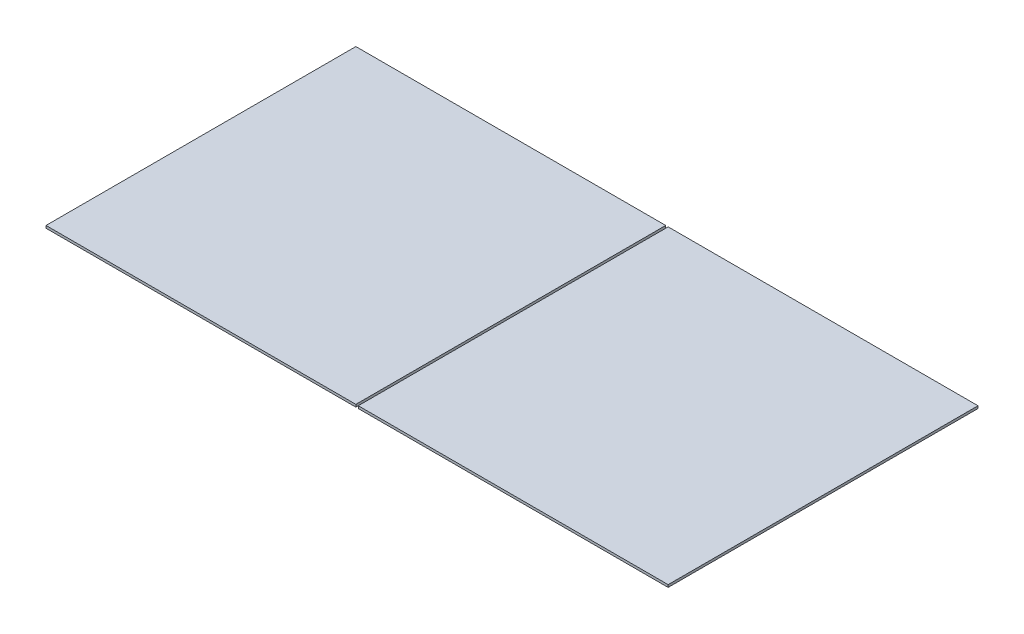
ISO-10303-21;
HEADER;
FILE_DESCRIPTION(('STEP AP214'),'2;1');
FILE_NAME('part.step','',(''),(''),'','','');
FILE_SCHEMA(('AUTOMOTIVE_DESIGN { 1 0 10303 214 1 1 1 1 }'));
ENDSEC;
DATA;
#1=APPLICATION_CONTEXT('core data for automotive mechanical design processes');
#2=APPLICATION_PROTOCOL_DEFINITION('international standard','automotive_design',2000,#1);
#3=PRODUCT_CONTEXT('',#1,'mechanical');
#4=PRODUCT('Part','Part','',(#3));
#5=PRODUCT_RELATED_PRODUCT_CATEGORY('part','',(#4));
#6=PRODUCT_DEFINITION_FORMATION('','',#4);
#7=PRODUCT_DEFINITION_CONTEXT('part definition',#1,'design');
#8=PRODUCT_DEFINITION('design','',#6,#7);
#9=PRODUCT_DEFINITION_SHAPE('','',#8);
#10=(LENGTH_UNIT() NAMED_UNIT(*) SI_UNIT(.MILLI.,.METRE.));
#11=(NAMED_UNIT(*) PLANE_ANGLE_UNIT() SI_UNIT($,.RADIAN.));
#12=(NAMED_UNIT(*) SI_UNIT($,.STERADIAN.) SOLID_ANGLE_UNIT());
#13=UNCERTAINTY_MEASURE_WITH_UNIT(LENGTH_MEASURE(1.E-05),#10,'distance_accuracy_value','');
#14=(GEOMETRIC_REPRESENTATION_CONTEXT(3) GLOBAL_UNCERTAINTY_ASSIGNED_CONTEXT((#13)) GLOBAL_UNIT_ASSIGNED_CONTEXT((#10,
#11,#12)) REPRESENTATION_CONTEXT('',''));
#15=CARTESIAN_POINT('',(0.,0.,0.));
#16=DIRECTION('',(0.,0.,1.));
#17=DIRECTION('',(1.,0.,0.));
#18=AXIS2_PLACEMENT_3D('',#15,#16,#17);
#19=CARTESIAN_POINT('',(191.5,1.,-63.5));
#20=DIRECTION('',(0.,0.,1.));
#21=DIRECTION('',(1.,0.,0.));
#22=AXIS2_PLACEMENT_3D('',#19,#20,#21);
#23=PLANE('',#22);
#24=DIRECTION('',(-1.,0.,0.));
#25=VECTOR('',#24,1.);
#26=CARTESIAN_POINT('',(191.5,0.,-63.5));
#27=LINE('',#26,#25);
#28=CARTESIAN_POINT('',(191.5,0.,-63.5));
#29=VERTEX_POINT('',#28);
#30=CARTESIAN_POINT('',(64.5,0.,-63.5));
#31=VERTEX_POINT('',#30);
#32=EDGE_CURVE('E106',#29,#31,#27,.T.);
#33=ORIENTED_EDGE('',*,*,#32,.T.);
#34=DIRECTION('',(0.,-1.,0.));
#35=VECTOR('',#34,1.);
#36=CARTESIAN_POINT('',(64.5,1.,-63.5));
#37=LINE('',#36,#35);
#38=CARTESIAN_POINT('',(64.5,1.,-63.5));
#39=VERTEX_POINT('',#38);
#40=EDGE_CURVE('E12',#39,#31,#37,.T.);
#41=ORIENTED_EDGE('',*,*,#40,.F.);
#42=DIRECTION('',(-1.,0.,0.));
#43=VECTOR('',#42,1.);
#44=CARTESIAN_POINT('',(191.5,1.,-63.5));
#45=LINE('',#44,#43);
#46=CARTESIAN_POINT('',(191.5,1.,-63.5));
#47=VERTEX_POINT('',#46);
#48=EDGE_CURVE('E94',#47,#39,#45,.T.);
#49=ORIENTED_EDGE('',*,*,#48,.F.);
#50=DIRECTION('',(0.,-1.,0.));
#51=VECTOR('',#50,1.);
#52=CARTESIAN_POINT('',(191.5,1.,-63.5));
#53=LINE('',#52,#51);
#54=EDGE_CURVE('E102',#47,#29,#53,.T.);
#55=ORIENTED_EDGE('',*,*,#54,.T.);
#56=EDGE_LOOP('',(#33,#41,#49,#55));
#57=FACE_BOUND('',#56,.T.);
#58=ADVANCED_FACE('F43',(#57),#23,.F.);
#59=CARTESIAN_POINT('',(64.5,1.,-63.5));
#60=DIRECTION('',(1.,0.,0.));
#61=DIRECTION('',(0.,0.,-1.));
#62=AXIS2_PLACEMENT_3D('',#59,#60,#61);
#63=PLANE('',#62);
#64=DIRECTION('',(0.,0.,1.));
#65=VECTOR('',#64,1.);
#66=CARTESIAN_POINT('',(64.5,0.,-63.5));
#67=LINE('',#66,#65);
#68=CARTESIAN_POINT('',(64.5,0.,63.5));
#69=VERTEX_POINT('',#68);
#70=EDGE_CURVE('E98',#31,#69,#67,.T.);
#71=ORIENTED_EDGE('',*,*,#70,.T.);
#72=DIRECTION('',(0.,-1.,0.));
#73=VECTOR('',#72,1.);
#74=CARTESIAN_POINT('',(64.5,1.,63.5));
#75=LINE('',#74,#73);
#76=CARTESIAN_POINT('',(64.5,1.,63.5));
#77=VERTEX_POINT('',#76);
#78=EDGE_CURVE('E51',#77,#69,#75,.T.);
#79=ORIENTED_EDGE('',*,*,#78,.F.);
#80=DIRECTION('',(0.,0.,1.));
#81=VECTOR('',#80,1.);
#82=CARTESIAN_POINT('',(64.5,1.,-63.5));
#83=LINE('',#82,#81);
#84=EDGE_CURVE('E89',#39,#77,#83,.T.);
#85=ORIENTED_EDGE('',*,*,#84,.F.);
#86=ORIENTED_EDGE('',*,*,#40,.T.);
#87=EDGE_LOOP('',(#71,#79,#85,#86));
#88=FACE_BOUND('',#87,.T.);
#89=ADVANCED_FACE('F97',(#88),#63,.F.);
#90=CARTESIAN_POINT('',(191.5,1.,63.5));
#91=DIRECTION('',(0.,0.,-1.));
#92=DIRECTION('',(-1.,0.,0.));
#93=AXIS2_PLACEMENT_3D('',#90,#91,#92);
#94=PLANE('',#93);
#95=DIRECTION('',(1.,0.,0.));
#96=VECTOR('',#95,1.);
#97=CARTESIAN_POINT('',(191.5,0.,63.5));
#98=LINE('',#97,#96);
#99=CARTESIAN_POINT('',(191.5,0.,63.5));
#100=VERTEX_POINT('',#99);
#101=EDGE_CURVE('E76',#69,#100,#98,.T.);
#102=ORIENTED_EDGE('',*,*,#101,.T.);
#103=DIRECTION('',(0.,-1.,0.));
#104=VECTOR('',#103,1.);
#105=CARTESIAN_POINT('',(191.5,1.,63.5));
#106=LINE('',#105,#104);
#107=CARTESIAN_POINT('',(191.5,1.,63.5));
#108=VERTEX_POINT('',#107);
#109=EDGE_CURVE('E99',#108,#100,#106,.T.);
#110=ORIENTED_EDGE('',*,*,#109,.F.);
#111=DIRECTION('',(1.,0.,0.));
#112=VECTOR('',#111,1.);
#113=CARTESIAN_POINT('',(191.5,1.,63.5));
#114=LINE('',#113,#112);
#115=EDGE_CURVE('E92',#77,#108,#114,.T.);
#116=ORIENTED_EDGE('',*,*,#115,.F.);
#117=ORIENTED_EDGE('',*,*,#78,.T.);
#118=EDGE_LOOP('',(#102,#110,#116,#117));
#119=FACE_BOUND('',#118,.T.);
#120=ADVANCED_FACE('F100',(#119),#94,.F.);
#121=CARTESIAN_POINT('',(191.5,1.,-63.5));
#122=DIRECTION('',(-1.,0.,0.));
#123=DIRECTION('',(0.,0.,1.));
#124=AXIS2_PLACEMENT_3D('',#121,#122,#123);
#125=PLANE('',#124);
#126=DIRECTION('',(0.,0.,-1.));
#127=VECTOR('',#126,1.);
#128=CARTESIAN_POINT('',(191.5,0.,-63.5));
#129=LINE('',#128,#127);
#130=EDGE_CURVE('E82',#100,#29,#129,.T.);
#131=ORIENTED_EDGE('',*,*,#130,.T.);
#132=ORIENTED_EDGE('',*,*,#54,.F.);
#133=DIRECTION('',(0.,0.,-1.));
#134=VECTOR('',#133,1.);
#135=CARTESIAN_POINT('',(191.5,1.,-63.5));
#136=LINE('',#135,#134);
#137=EDGE_CURVE('E59',#108,#47,#136,.T.);
#138=ORIENTED_EDGE('',*,*,#137,.F.);
#139=ORIENTED_EDGE('',*,*,#109,.T.);
#140=EDGE_LOOP('',(#131,#132,#138,#139));
#141=FACE_BOUND('',#140,.T.);
#142=ADVANCED_FACE('F113',(#141),#125,.F.);
#143=CARTESIAN_POINT('',(0.,1.,0.));
#144=DIRECTION('',(0.,1.,0.));
#145=DIRECTION('',(0.,0.,1.));
#146=AXIS2_PLACEMENT_3D('',#143,#144,#145);
#147=PLANE('',#146);
#148=ORIENTED_EDGE('',*,*,#48,.T.);
#149=ORIENTED_EDGE('',*,*,#84,.T.);
#150=ORIENTED_EDGE('',*,*,#115,.T.);
#151=ORIENTED_EDGE('',*,*,#137,.T.);
#152=EDGE_LOOP('',(#148,#149,#150,#151));
#153=FACE_BOUND('',#152,.T.);
#154=ADVANCED_FACE('F90',(#153),#147,.T.);
#155=CARTESIAN_POINT('',(0.,0.,0.));
#156=DIRECTION('',(0.,1.,0.));
#157=DIRECTION('',(0.,0.,1.));
#158=AXIS2_PLACEMENT_3D('',#155,#156,#157);
#159=PLANE('',#158);
#160=ORIENTED_EDGE('',*,*,#32,.F.);
#161=ORIENTED_EDGE('',*,*,#130,.F.);
#162=ORIENTED_EDGE('',*,*,#101,.F.);
#163=ORIENTED_EDGE('',*,*,#70,.F.);
#164=EDGE_LOOP('',(#160,#161,#162,#163));
#165=FACE_BOUND('',#164,.T.);
#166=ADVANCED_FACE('F116',(#165),#159,.F.);
#167=CLOSED_SHELL('',(#58,#89,#120,#142,#154,#166));
#168=MANIFOLD_SOLID_BREP('B2',#167);
#169=CARTESIAN_POINT('',(63.5,1.,-63.5));
#170=DIRECTION('',(-1.,0.,0.));
#171=DIRECTION('',(0.,0.,1.));
#172=AXIS2_PLACEMENT_3D('',#169,#170,#171);
#173=PLANE('',#172);
#174=DIRECTION('',(0.,0.,-1.));
#175=VECTOR('',#174,1.);
#176=CARTESIAN_POINT('',(63.5,0.,-63.5));
#177=LINE('',#176,#175);
#178=CARTESIAN_POINT('',(63.5,0.,63.5));
#179=VERTEX_POINT('',#178);
#180=CARTESIAN_POINT('',(63.5,0.,-63.5));
#181=VERTEX_POINT('',#180);
#182=EDGE_CURVE('E230',#179,#181,#177,.T.);
#183=ORIENTED_EDGE('',*,*,#182,.T.);
#184=DIRECTION('',(0.,-1.,0.));
#185=VECTOR('',#184,1.);
#186=CARTESIAN_POINT('',(63.5,1.,-63.5));
#187=LINE('',#186,#185);
#188=CARTESIAN_POINT('',(63.5,1.,-63.5));
#189=VERTEX_POINT('',#188);
#190=EDGE_CURVE('E41',#189,#181,#187,.T.);
#191=ORIENTED_EDGE('',*,*,#190,.F.);
#192=DIRECTION('',(0.,0.,-1.));
#193=VECTOR('',#192,1.);
#194=CARTESIAN_POINT('',(63.5,1.,-63.5));
#195=LINE('',#194,#193);
#196=CARTESIAN_POINT('',(63.5,1.,63.5));
#197=VERTEX_POINT('',#196);
#198=EDGE_CURVE('E218',#197,#189,#195,.T.);
#199=ORIENTED_EDGE('',*,*,#198,.F.);
#200=DIRECTION('',(0.,-1.,0.));
#201=VECTOR('',#200,1.);
#202=CARTESIAN_POINT('',(63.5,1.,63.5));
#203=LINE('',#202,#201);
#204=EDGE_CURVE('E226',#197,#179,#203,.T.);
#205=ORIENTED_EDGE('',*,*,#204,.T.);
#206=EDGE_LOOP('',(#183,#191,#199,#205));
#207=FACE_BOUND('',#206,.T.);
#208=ADVANCED_FACE('F167',(#207),#173,.F.);
#209=CARTESIAN_POINT('',(-63.5,1.,-63.5));
#210=DIRECTION('',(0.,0.,1.));
#211=DIRECTION('',(1.,0.,0.));
#212=AXIS2_PLACEMENT_3D('',#209,#210,#211);
#213=PLANE('',#212);
#214=DIRECTION('',(-1.,0.,0.));
#215=VECTOR('',#214,1.);
#216=CARTESIAN_POINT('',(-63.5,0.,-63.5));
#217=LINE('',#216,#215);
#218=CARTESIAN_POINT('',(-63.5,0.,-63.5));
#219=VERTEX_POINT('',#218);
#220=EDGE_CURVE('E222',#181,#219,#217,.T.);
#221=ORIENTED_EDGE('',*,*,#220,.T.);
#222=DIRECTION('',(0.,-1.,0.));
#223=VECTOR('',#222,1.);
#224=CARTESIAN_POINT('',(-63.5,1.,-63.5));
#225=LINE('',#224,#223);
#226=CARTESIAN_POINT('',(-63.5,1.,-63.5));
#227=VERTEX_POINT('',#226);
#228=EDGE_CURVE('E175',#227,#219,#225,.T.);
#229=ORIENTED_EDGE('',*,*,#228,.F.);
#230=DIRECTION('',(-1.,0.,0.));
#231=VECTOR('',#230,1.);
#232=CARTESIAN_POINT('',(-63.5,1.,-63.5));
#233=LINE('',#232,#231);
#234=EDGE_CURVE('E213',#189,#227,#233,.T.);
#235=ORIENTED_EDGE('',*,*,#234,.F.);
#236=ORIENTED_EDGE('',*,*,#190,.T.);
#237=EDGE_LOOP('',(#221,#229,#235,#236));
#238=FACE_BOUND('',#237,.T.);
#239=ADVANCED_FACE('F221',(#238),#213,.F.);
#240=CARTESIAN_POINT('',(-63.5,1.,-63.5));
#241=DIRECTION('',(1.,0.,0.));
#242=DIRECTION('',(0.,0.,-1.));
#243=AXIS2_PLACEMENT_3D('',#240,#241,#242);
#244=PLANE('',#243);
#245=DIRECTION('',(0.,0.,1.));
#246=VECTOR('',#245,1.);
#247=CARTESIAN_POINT('',(-63.5,0.,-63.5));
#248=LINE('',#247,#246);
#249=CARTESIAN_POINT('',(-63.5,0.,63.5));
#250=VERTEX_POINT('',#249);
#251=EDGE_CURVE('E200',#219,#250,#248,.T.);
#252=ORIENTED_EDGE('',*,*,#251,.T.);
#253=DIRECTION('',(0.,-1.,0.));
#254=VECTOR('',#253,1.);
#255=CARTESIAN_POINT('',(-63.5,1.,63.5));
#256=LINE('',#255,#254);
#257=CARTESIAN_POINT('',(-63.5,1.,63.5));
#258=VERTEX_POINT('',#257);
#259=EDGE_CURVE('E223',#258,#250,#256,.T.);
#260=ORIENTED_EDGE('',*,*,#259,.F.);
#261=DIRECTION('',(0.,0.,1.));
#262=VECTOR('',#261,1.);
#263=CARTESIAN_POINT('',(-63.5,1.,-63.5));
#264=LINE('',#263,#262);
#265=EDGE_CURVE('E216',#227,#258,#264,.T.);
#266=ORIENTED_EDGE('',*,*,#265,.F.);
#267=ORIENTED_EDGE('',*,*,#228,.T.);
#268=EDGE_LOOP('',(#252,#260,#266,#267));
#269=FACE_BOUND('',#268,.T.);
#270=ADVANCED_FACE('F224',(#269),#244,.F.);
#271=CARTESIAN_POINT('',(-63.5,1.,63.5));
#272=DIRECTION('',(0.,0.,-1.));
#273=DIRECTION('',(-1.,0.,0.));
#274=AXIS2_PLACEMENT_3D('',#271,#272,#273);
#275=PLANE('',#274);
#276=DIRECTION('',(1.,0.,0.));
#277=VECTOR('',#276,1.);
#278=CARTESIAN_POINT('',(-63.5,0.,63.5));
#279=LINE('',#278,#277);
#280=EDGE_CURVE('E206',#250,#179,#279,.T.);
#281=ORIENTED_EDGE('',*,*,#280,.T.);
#282=ORIENTED_EDGE('',*,*,#204,.F.);
#283=DIRECTION('',(1.,0.,0.));
#284=VECTOR('',#283,1.);
#285=CARTESIAN_POINT('',(-63.5,1.,63.5));
#286=LINE('',#285,#284);
#287=EDGE_CURVE('E183',#258,#197,#286,.T.);
#288=ORIENTED_EDGE('',*,*,#287,.F.);
#289=ORIENTED_EDGE('',*,*,#259,.T.);
#290=EDGE_LOOP('',(#281,#282,#288,#289));
#291=FACE_BOUND('',#290,.T.);
#292=ADVANCED_FACE('F237',(#291),#275,.F.);
#293=CARTESIAN_POINT('',(0.,1.,0.));
#294=DIRECTION('',(0.,1.,0.));
#295=DIRECTION('',(0.,0.,1.));
#296=AXIS2_PLACEMENT_3D('',#293,#294,#295);
#297=PLANE('',#296);
#298=ORIENTED_EDGE('',*,*,#198,.T.);
#299=ORIENTED_EDGE('',*,*,#234,.T.);
#300=ORIENTED_EDGE('',*,*,#265,.T.);
#301=ORIENTED_EDGE('',*,*,#287,.T.);
#302=EDGE_LOOP('',(#298,#299,#300,#301));
#303=FACE_BOUND('',#302,.T.);
#304=ADVANCED_FACE('F214',(#303),#297,.T.);
#305=CARTESIAN_POINT('',(0.,0.,0.));
#306=DIRECTION('',(0.,1.,0.));
#307=DIRECTION('',(0.,0.,1.));
#308=AXIS2_PLACEMENT_3D('',#305,#306,#307);
#309=PLANE('',#308);
#310=ORIENTED_EDGE('',*,*,#182,.F.);
#311=ORIENTED_EDGE('',*,*,#280,.F.);
#312=ORIENTED_EDGE('',*,*,#251,.F.);
#313=ORIENTED_EDGE('',*,*,#220,.F.);
#314=EDGE_LOOP('',(#310,#311,#312,#313));
#315=FACE_BOUND('',#314,.T.);
#316=ADVANCED_FACE('F240',(#315),#309,.F.);
#317=CLOSED_SHELL('',(#208,#239,#270,#292,#304,#316));
#318=MANIFOLD_SOLID_BREP('B6',#317);
#319=ADVANCED_BREP_SHAPE_REPRESENTATION('',(#18,#168,#318),#14);
#320=SHAPE_DEFINITION_REPRESENTATION(#9,#319);
ENDSEC;
END-ISO-10303-21;
